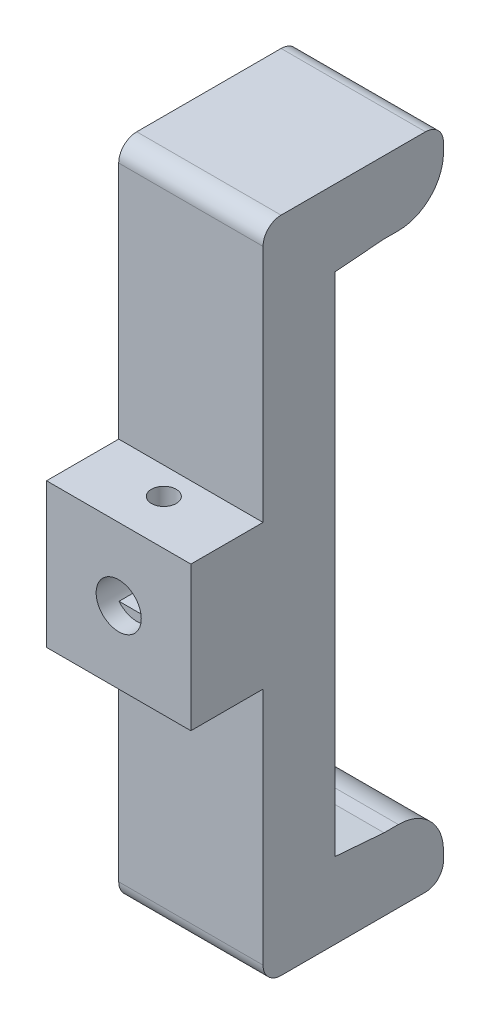
ISO-10303-21;
HEADER;
FILE_DESCRIPTION(('STEP AP214'),'2;1');
FILE_NAME('part.step','',(''),(''),'','','');
FILE_SCHEMA(('AUTOMOTIVE_DESIGN { 1 0 10303 214 1 1 1 1 }'));
ENDSEC;
DATA;
#1=APPLICATION_CONTEXT('core data for automotive mechanical design processes');
#2=APPLICATION_PROTOCOL_DEFINITION('international standard','automotive_design',2000,#1);
#3=PRODUCT_CONTEXT('',#1,'mechanical');
#4=PRODUCT('Part','Part','',(#3));
#5=PRODUCT_RELATED_PRODUCT_CATEGORY('part','',(#4));
#6=PRODUCT_DEFINITION_FORMATION('','',#4);
#7=PRODUCT_DEFINITION_CONTEXT('part definition',#1,'design');
#8=PRODUCT_DEFINITION('design','',#6,#7);
#9=PRODUCT_DEFINITION_SHAPE('','',#8);
#10=(LENGTH_UNIT() NAMED_UNIT(*) SI_UNIT(.MILLI.,.METRE.));
#11=(NAMED_UNIT(*) PLANE_ANGLE_UNIT() SI_UNIT($,.RADIAN.));
#12=(NAMED_UNIT(*) SI_UNIT($,.STERADIAN.) SOLID_ANGLE_UNIT());
#13=UNCERTAINTY_MEASURE_WITH_UNIT(LENGTH_MEASURE(1.E-05),#10,'distance_accuracy_value','');
#14=(GEOMETRIC_REPRESENTATION_CONTEXT(3) GLOBAL_UNCERTAINTY_ASSIGNED_CONTEXT((#13)) GLOBAL_UNIT_ASSIGNED_CONTEXT((#10,
#11,#12)) REPRESENTATION_CONTEXT('',''));
#15=CARTESIAN_POINT('',(0.,0.,0.));
#16=DIRECTION('',(0.,0.,1.));
#17=DIRECTION('',(1.,0.,0.));
#18=AXIS2_PLACEMENT_3D('',#15,#16,#17);
#19=CARTESIAN_POINT('',(0.,-1.55,44.5));
#20=DIRECTION('',(0.,1.,0.));
#21=DIRECTION('',(0.,0.,1.));
#22=AXIS2_PLACEMENT_3D('',#19,#20,#21);
#23=PLANE('',#22);
#24=DIRECTION('',(0.,0.,-1.));
#25=VECTOR('',#24,1.);
#26=CARTESIAN_POINT('',(-1.9615045245933,-1.55,44.5));
#27=LINE('',#26,#25);
#28=CARTESIAN_POINT('',(-1.9615045245933,-1.55,42.5));
#29=VERTEX_POINT('',#28);
#30=CARTESIAN_POINT('',(-1.9615045245933,-1.55,36.5));
#31=VERTEX_POINT('',#30);
#32=EDGE_CURVE('E57',#29,#31,#27,.T.);
#33=ORIENTED_EDGE('',*,*,#32,.F.);
#34=DIRECTION('',(1.,0.,0.));
#35=VECTOR('',#34,1.);
#36=CARTESIAN_POINT('',(0.,-1.55,42.5));
#37=LINE('',#36,#35);
#38=CARTESIAN_POINT('',(1.9615045245933,-1.55,42.5));
#39=VERTEX_POINT('',#38);
#40=EDGE_CURVE('E209',#29,#39,#37,.T.);
#41=ORIENTED_EDGE('',*,*,#40,.T.);
#42=DIRECTION('',(0.,0.,-1.));
#43=VECTOR('',#42,1.);
#44=CARTESIAN_POINT('',(1.9615045245933,-1.55,44.5));
#45=LINE('',#44,#43);
#46=CARTESIAN_POINT('',(1.9615045245933,-1.55,36.5));
#47=VERTEX_POINT('',#46);
#48=EDGE_CURVE('E49',#39,#47,#45,.T.);
#49=ORIENTED_EDGE('',*,*,#48,.T.);
#50=DIRECTION('',(1.,0.,0.));
#51=VECTOR('',#50,1.);
#52=CARTESIAN_POINT('',(0.,-1.55,36.5));
#53=LINE('',#52,#51);
#54=EDGE_CURVE('E428',#31,#47,#53,.T.);
#55=ORIENTED_EDGE('',*,*,#54,.F.);
#56=EDGE_LOOP('',(#33,#41,#49,#55));
#57=FACE_BOUND('',#56,.T.);
#58=ADVANCED_FACE('F34',(#57),#23,.T.);
#59=CARTESIAN_POINT('',(0.,1.55,44.5));
#60=DIRECTION('',(0.,1.,0.));
#61=DIRECTION('',(0.,0.,1.));
#62=AXIS2_PLACEMENT_3D('',#59,#60,#61);
#63=PLANE('',#62);
#64=CARTESIAN_POINT('',(0.,1.55,39.5));
#65=DIRECTION('',(0.,1.,0.));
#66=DIRECTION('',(0.,0.,1.));
#67=AXIS2_PLACEMENT_3D('',#64,#65,#66);
#68=CIRCLE('',#67,1.375);
#69=CARTESIAN_POINT('',(0.,1.55,40.875));
#70=VERTEX_POINT('',#69);
#71=EDGE_CURVE('E441',#70,#70,#68,.F.);
#72=ORIENTED_EDGE('',*,*,#71,.F.);
#73=EDGE_LOOP('',(#72));
#74=FACE_BOUND('',#73,.T.);
#75=DIRECTION('',(1.,0.,0.));
#76=VECTOR('',#75,1.);
#77=CARTESIAN_POINT('',(0.,1.55,42.5));
#78=LINE('',#77,#76);
#79=CARTESIAN_POINT('',(-1.9615045245933,1.55,42.5));
#80=VERTEX_POINT('',#79);
#81=CARTESIAN_POINT('',(1.9615045245933,1.55,42.5));
#82=VERTEX_POINT('',#81);
#83=EDGE_CURVE('E11',#80,#82,#78,.T.);
#84=ORIENTED_EDGE('',*,*,#83,.F.);
#85=DIRECTION('',(0.,0.,-1.));
#86=VECTOR('',#85,1.);
#87=CARTESIAN_POINT('',(-1.9615045245933,1.55,44.5));
#88=LINE('',#87,#86);
#89=CARTESIAN_POINT('',(-1.9615045245933,1.55,36.5));
#90=VERTEX_POINT('',#89);
#91=EDGE_CURVE('E208',#80,#90,#88,.T.);
#92=ORIENTED_EDGE('',*,*,#91,.T.);
#93=DIRECTION('',(1.,0.,0.));
#94=VECTOR('',#93,1.);
#95=CARTESIAN_POINT('',(0.,1.55,36.5));
#96=LINE('',#95,#94);
#97=CARTESIAN_POINT('',(1.9615045245933,1.55,36.5));
#98=VERTEX_POINT('',#97);
#99=EDGE_CURVE('E215',#90,#98,#96,.T.);
#100=ORIENTED_EDGE('',*,*,#99,.T.);
#101=DIRECTION('',(0.,0.,-1.));
#102=VECTOR('',#101,1.);
#103=CARTESIAN_POINT('',(1.9615045245933,1.55,44.5));
#104=LINE('',#103,#102);
#105=EDGE_CURVE('E206',#82,#98,#104,.T.);
#106=ORIENTED_EDGE('',*,*,#105,.F.);
#107=EDGE_LOOP('',(#84,#92,#100,#106));
#108=FACE_BOUND('',#107,.T.);
#109=ADVANCED_FACE('F213',(#74,#108),#63,.F.);
#110=CARTESIAN_POINT('',(8.,0.,36.5));
#111=DIRECTION('',(0.,0.,-1.));
#112=DIRECTION('',(-1.,0.,0.));
#113=AXIS2_PLACEMENT_3D('',#110,#111,#112);
#114=PLANE('',#113);
#115=DIRECTION('',(-1.,0.,0.));
#116=VECTOR('',#115,1.);
#117=CARTESIAN_POINT('',(0.,8.,36.5));
#118=LINE('',#117,#116);
#119=CARTESIAN_POINT('',(8.,8.,36.5));
#120=VERTEX_POINT('',#119);
#121=CARTESIAN_POINT('',(-8.,8.,36.5));
#122=VERTEX_POINT('',#121);
#123=EDGE_CURVE('E415',#120,#122,#118,.T.);
#124=ORIENTED_EDGE('',*,*,#123,.F.);
#125=DIRECTION('',(0.,-1.,0.));
#126=VECTOR('',#125,1.);
#127=CARTESIAN_POINT('',(8.,0.,36.5));
#128=LINE('',#127,#126);
#129=CARTESIAN_POINT('',(8.,34.5,36.5));
#130=VERTEX_POINT('',#129);
#131=EDGE_CURVE('E314',#130,#120,#128,.T.);
#132=ORIENTED_EDGE('',*,*,#131,.F.);
#133=DIRECTION('',(-1.,0.,0.));
#134=VECTOR('',#133,1.);
#135=CARTESIAN_POINT('',(8.,34.5,36.5));
#136=LINE('',#135,#134);
#137=CARTESIAN_POINT('',(-8.,34.5,36.5));
#138=VERTEX_POINT('',#137);
#139=EDGE_CURVE('E317',#130,#138,#136,.T.);
#140=ORIENTED_EDGE('',*,*,#139,.T.);
#141=DIRECTION('',(0.,-1.,0.));
#142=VECTOR('',#141,1.);
#143=CARTESIAN_POINT('',(-8.,0.,36.5));
#144=LINE('',#143,#142);
#145=EDGE_CURVE('E299',#138,#122,#144,.T.);
#146=ORIENTED_EDGE('',*,*,#145,.T.);
#147=EDGE_LOOP('',(#124,#132,#140,#146));
#148=FACE_BOUND('',#147,.T.);
#149=ADVANCED_FACE('F466',(#148),#114,.F.);
#150=CARTESIAN_POINT('',(8.,0.,28.5));
#151=DIRECTION('',(0.,0.,1.));
#152=DIRECTION('',(1.,0.,0.));
#153=AXIS2_PLACEMENT_3D('',#150,#151,#152);
#154=PLANE('',#153);
#155=DIRECTION('',(0.,1.,0.));
#156=VECTOR('',#155,1.);
#157=CARTESIAN_POINT('',(-8.,0.,28.5));
#158=LINE('',#157,#156);
#159=CARTESIAN_POINT('',(-8.,-28.0690186257543,28.5));
#160=VERTEX_POINT('',#159);
#161=CARTESIAN_POINT('',(-8.,28.0690186257543,28.5));
#162=VERTEX_POINT('',#161);
#163=EDGE_CURVE('E295',#160,#162,#158,.T.);
#164=ORIENTED_EDGE('',*,*,#163,.T.);
#165=DIRECTION('',(-1.,0.,0.));
#166=VECTOR('',#165,1.);
#167=CARTESIAN_POINT('',(8.,28.0690186257543,28.5));
#168=LINE('',#167,#166);
#169=CARTESIAN_POINT('',(8.,28.0690186257543,28.5));
#170=VERTEX_POINT('',#169);
#171=EDGE_CURVE('E42',#170,#162,#168,.T.);
#172=ORIENTED_EDGE('',*,*,#171,.F.);
#173=DIRECTION('',(0.,1.,0.));
#174=VECTOR('',#173,1.);
#175=CARTESIAN_POINT('',(8.,0.,28.5));
#176=LINE('',#175,#174);
#177=CARTESIAN_POINT('',(8.,-28.0690186257543,28.5));
#178=VERTEX_POINT('',#177);
#179=EDGE_CURVE('E296',#178,#170,#176,.T.);
#180=ORIENTED_EDGE('',*,*,#179,.F.);
#181=DIRECTION('',(-1.,0.,0.));
#182=VECTOR('',#181,1.);
#183=CARTESIAN_POINT('',(8.,-28.0690186257543,28.5));
#184=LINE('',#183,#182);
#185=EDGE_CURVE('E292',#178,#160,#184,.T.);
#186=ORIENTED_EDGE('',*,*,#185,.T.);
#187=EDGE_LOOP('',(#164,#172,#180,#186));
#188=FACE_BOUND('',#187,.T.);
#189=ADVANCED_FACE('F36',(#188),#154,.F.);
#190=CARTESIAN_POINT('',(8.,28.0690186257543,28.5));
#191=DIRECTION('',(0.,0.99684266207468,0.0794021855358291));
#192=DIRECTION('',(0.,-0.0794021855358291,0.99684266207468));
#193=AXIS2_PLACEMENT_3D('',#190,#191,#192);
#194=PLANE('',#193);
#195=DIRECTION('',(0.,0.0794021855358291,-0.99684266207468));
#196=VECTOR('',#195,1.);
#197=CARTESIAN_POINT('',(-8.,28.0690186257543,28.5));
#198=LINE('',#197,#196);
#199=CARTESIAN_POINT('',(-8.,28.5,23.0893098847535));
#200=VERTEX_POINT('',#199);
#201=EDGE_CURVE('E319',#162,#200,#198,.T.);
#202=ORIENTED_EDGE('',*,*,#201,.T.);
#203=DIRECTION('',(-1.,0.,0.));
#204=VECTOR('',#203,1.);
#205=CARTESIAN_POINT('',(8.,28.5,23.0893098847535));
#206=LINE('',#205,#204);
#207=CARTESIAN_POINT('',(8.,28.5,23.0893098847535));
#208=VERTEX_POINT('',#207);
#209=EDGE_CURVE('E352',#208,#200,#206,.T.);
#210=ORIENTED_EDGE('',*,*,#209,.F.);
#211=DIRECTION('',(0.,0.0794021855358291,-0.99684266207468));
#212=VECTOR('',#211,1.);
#213=CARTESIAN_POINT('',(8.,28.0690186257543,28.5));
#214=LINE('',#213,#212);
#215=EDGE_CURVE('E298',#170,#208,#214,.T.);
#216=ORIENTED_EDGE('',*,*,#215,.F.);
#217=ORIENTED_EDGE('',*,*,#171,.T.);
#218=EDGE_LOOP('',(#202,#210,#216,#217));
#219=FACE_BOUND('',#218,.T.);
#220=ADVANCED_FACE('F359',(#219),#194,.F.);
#221=CARTESIAN_POINT('',(8.,28.5,21.5));
#222=DIRECTION('',(0.,1.,0.));
#223=DIRECTION('',(0.,0.,1.));
#224=AXIS2_PLACEMENT_3D('',#221,#222,#223);
#225=PLANE('',#224);
#226=DIRECTION('',(0.,0.,-1.));
#227=VECTOR('',#226,1.);
#228=CARTESIAN_POINT('',(-8.,28.5,21.5));
#229=LINE('',#228,#227);
#230=CARTESIAN_POINT('',(-8.,28.5,21.5));
#231=VERTEX_POINT('',#230);
#232=EDGE_CURVE('E321',#200,#231,#229,.T.);
#233=ORIENTED_EDGE('',*,*,#232,.T.);
#234=DIRECTION('',(-1.,0.,0.));
#235=VECTOR('',#234,1.);
#236=CARTESIAN_POINT('',(8.,28.5,21.5));
#237=LINE('',#236,#235);
#238=CARTESIAN_POINT('',(8.,28.5,21.5));
#239=VERTEX_POINT('',#238);
#240=EDGE_CURVE('E349',#239,#231,#237,.T.);
#241=ORIENTED_EDGE('',*,*,#240,.F.);
#242=DIRECTION('',(0.,0.,-1.));
#243=VECTOR('',#242,1.);
#244=CARTESIAN_POINT('',(8.,28.5,21.5));
#245=LINE('',#244,#243);
#246=EDGE_CURVE('E301',#208,#239,#245,.T.);
#247=ORIENTED_EDGE('',*,*,#246,.F.);
#248=ORIENTED_EDGE('',*,*,#209,.T.);
#249=EDGE_LOOP('',(#233,#241,#247,#248));
#250=FACE_BOUND('',#249,.T.);
#251=ADVANCED_FACE('F370',(#250),#225,.F.);
#252=CARTESIAN_POINT('',(8.,33.5,21.5));
#253=DIRECTION('',(-1.,0.,0.));
#254=DIRECTION('',(0.,0.,1.));
#255=AXIS2_PLACEMENT_3D('',#252,#253,#254);
#256=CYLINDRICAL_SURFACE('',#255,5.);
#257=CARTESIAN_POINT('',(-8.,33.5,21.5));
#258=DIRECTION('',(1.,0.,0.));
#259=DIRECTION('',(0.,0.,1.));
#260=AXIS2_PLACEMENT_3D('',#257,#258,#259);
#261=CIRCLE('',#260,5.);
#262=CARTESIAN_POINT('',(-8.,33.5,16.5));
#263=VERTEX_POINT('',#262);
#264=EDGE_CURVE('E323',#231,#263,#261,.T.);
#265=ORIENTED_EDGE('',*,*,#264,.T.);
#266=DIRECTION('',(-1.,0.,0.));
#267=VECTOR('',#266,1.);
#268=CARTESIAN_POINT('',(8.,33.5,16.5));
#269=LINE('',#268,#267);
#270=CARTESIAN_POINT('',(8.,33.5,16.5));
#271=VERTEX_POINT('',#270);
#272=EDGE_CURVE('E346',#271,#263,#269,.T.);
#273=ORIENTED_EDGE('',*,*,#272,.F.);
#274=CARTESIAN_POINT('',(8.,33.5,21.5));
#275=DIRECTION('',(1.,0.,0.));
#276=DIRECTION('',(0.,0.,1.));
#277=AXIS2_PLACEMENT_3D('',#274,#275,#276);
#278=CIRCLE('',#277,5.);
#279=EDGE_CURVE('E303',#239,#271,#278,.T.);
#280=ORIENTED_EDGE('',*,*,#279,.F.);
#281=ORIENTED_EDGE('',*,*,#240,.T.);
#282=EDGE_LOOP('',(#265,#273,#280,#281));
#283=FACE_BOUND('',#282,.T.);
#284=ADVANCED_FACE('F374',(#283),#256,.T.);
#285=CARTESIAN_POINT('',(8.,34.5,16.5));
#286=DIRECTION('',(0.,0.,1.));
#287=DIRECTION('',(0.,-1.,0.));
#288=AXIS2_PLACEMENT_3D('',#285,#286,#287);
#289=PLANE('',#288);
#290=DIRECTION('',(0.,1.,0.));
#291=VECTOR('',#290,1.);
#292=CARTESIAN_POINT('',(-8.,34.5,16.5));
#293=LINE('',#292,#291);
#294=CARTESIAN_POINT('',(-8.,34.5,16.5));
#295=VERTEX_POINT('',#294);
#296=EDGE_CURVE('E325',#263,#295,#293,.T.);
#297=ORIENTED_EDGE('',*,*,#296,.T.);
#298=DIRECTION('',(-1.,0.,0.));
#299=VECTOR('',#298,1.);
#300=CARTESIAN_POINT('',(8.,34.5,16.5));
#301=LINE('',#300,#299);
#302=CARTESIAN_POINT('',(8.,34.5,16.5));
#303=VERTEX_POINT('',#302);
#304=EDGE_CURVE('E343',#303,#295,#301,.T.);
#305=ORIENTED_EDGE('',*,*,#304,.F.);
#306=DIRECTION('',(0.,1.,0.));
#307=VECTOR('',#306,1.);
#308=CARTESIAN_POINT('',(8.,34.5,16.5));
#309=LINE('',#308,#307);
#310=EDGE_CURVE('E305',#271,#303,#309,.T.);
#311=ORIENTED_EDGE('',*,*,#310,.F.);
#312=ORIENTED_EDGE('',*,*,#272,.T.);
#313=EDGE_LOOP('',(#297,#305,#311,#312));
#314=FACE_BOUND('',#313,.T.);
#315=ADVANCED_FACE('F480',(#314),#289,.F.);
#316=CARTESIAN_POINT('',(8.,34.5,18.5));
#317=DIRECTION('',(-1.,0.,0.));
#318=DIRECTION('',(0.,0.,1.));
#319=AXIS2_PLACEMENT_3D('',#316,#317,#318);
#320=CYLINDRICAL_SURFACE('',#319,2.);
#321=CARTESIAN_POINT('',(-8.,34.5,18.5));
#322=DIRECTION('',(1.,0.,0.));
#323=DIRECTION('',(0.,0.,1.));
#324=AXIS2_PLACEMENT_3D('',#321,#322,#323);
#325=CIRCLE('',#324,2.);
#326=CARTESIAN_POINT('',(-8.,36.5,18.5));
#327=VERTEX_POINT('',#326);
#328=EDGE_CURVE('E327',#295,#327,#325,.T.);
#329=ORIENTED_EDGE('',*,*,#328,.T.);
#330=DIRECTION('',(-1.,0.,0.));
#331=VECTOR('',#330,1.);
#332=CARTESIAN_POINT('',(8.,36.5,18.5));
#333=LINE('',#332,#331);
#334=CARTESIAN_POINT('',(8.,36.5,18.5));
#335=VERTEX_POINT('',#334);
#336=EDGE_CURVE('E340',#335,#327,#333,.T.);
#337=ORIENTED_EDGE('',*,*,#336,.F.);
#338=CARTESIAN_POINT('',(8.,34.5,18.5));
#339=DIRECTION('',(1.,0.,0.));
#340=DIRECTION('',(0.,0.,1.));
#341=AXIS2_PLACEMENT_3D('',#338,#339,#340);
#342=CIRCLE('',#341,2.);
#343=EDGE_CURVE('E307',#303,#335,#342,.T.);
#344=ORIENTED_EDGE('',*,*,#343,.F.);
#345=ORIENTED_EDGE('',*,*,#304,.T.);
#346=EDGE_LOOP('',(#329,#337,#344,#345));
#347=FACE_BOUND('',#346,.T.);
#348=ADVANCED_FACE('F478',(#347),#320,.T.);
#349=CARTESIAN_POINT('',(8.,36.5,34.5));
#350=DIRECTION('',(0.,-1.,0.));
#351=DIRECTION('',(0.,0.,-1.));
#352=AXIS2_PLACEMENT_3D('',#349,#350,#351);
#353=PLANE('',#352);
#354=DIRECTION('',(0.,0.,1.));
#355=VECTOR('',#354,1.);
#356=CARTESIAN_POINT('',(-8.,36.5,34.5));
#357=LINE('',#356,#355);
#358=CARTESIAN_POINT('',(-8.,36.5,34.5));
#359=VERTEX_POINT('',#358);
#360=EDGE_CURVE('E329',#327,#359,#357,.T.);
#361=ORIENTED_EDGE('',*,*,#360,.T.);
#362=DIRECTION('',(-1.,0.,0.));
#363=VECTOR('',#362,1.);
#364=CARTESIAN_POINT('',(8.,36.5,34.5));
#365=LINE('',#364,#363);
#366=CARTESIAN_POINT('',(8.,36.5,34.5));
#367=VERTEX_POINT('',#366);
#368=EDGE_CURVE('E337',#367,#359,#365,.T.);
#369=ORIENTED_EDGE('',*,*,#368,.F.);
#370=DIRECTION('',(0.,0.,1.));
#371=VECTOR('',#370,1.);
#372=CARTESIAN_POINT('',(8.,36.5,34.5));
#373=LINE('',#372,#371);
#374=EDGE_CURVE('E309',#335,#367,#373,.T.);
#375=ORIENTED_EDGE('',*,*,#374,.F.);
#376=ORIENTED_EDGE('',*,*,#336,.T.);
#377=EDGE_LOOP('',(#361,#369,#375,#376));
#378=FACE_BOUND('',#377,.T.);
#379=ADVANCED_FACE('F473',(#378),#353,.F.);
#380=CARTESIAN_POINT('',(8.,34.5,34.5));
#381=DIRECTION('',(-1.,0.,0.));
#382=DIRECTION('',(0.,0.,1.));
#383=AXIS2_PLACEMENT_3D('',#380,#381,#382);
#384=CYLINDRICAL_SURFACE('',#383,2.);
#385=CARTESIAN_POINT('',(-8.,34.5,34.5));
#386=DIRECTION('',(1.,0.,0.));
#387=DIRECTION('',(0.,0.,1.));
#388=AXIS2_PLACEMENT_3D('',#385,#386,#387);
#389=CIRCLE('',#388,2.);
#390=EDGE_CURVE('E331',#359,#138,#389,.T.);
#391=ORIENTED_EDGE('',*,*,#390,.T.);
#392=ORIENTED_EDGE('',*,*,#139,.F.);
#393=CARTESIAN_POINT('',(8.,34.5,34.5));
#394=DIRECTION('',(1.,0.,0.));
#395=DIRECTION('',(0.,0.,1.));
#396=AXIS2_PLACEMENT_3D('',#393,#394,#395);
#397=CIRCLE('',#396,2.);
#398=EDGE_CURVE('E311',#367,#130,#397,.T.);
#399=ORIENTED_EDGE('',*,*,#398,.F.);
#400=ORIENTED_EDGE('',*,*,#368,.T.);
#401=EDGE_LOOP('',(#391,#392,#399,#400));
#402=FACE_BOUND('',#401,.T.);
#403=ADVANCED_FACE('F468',(#402),#384,.T.);
#404=CARTESIAN_POINT('',(8.,-7.99999999999999,36.5));
#405=VERTEX_POINT('',#404);
#406=CARTESIAN_POINT('',(8.,-34.5,36.5));
#407=VERTEX_POINT('',#406);
#408=EDGE_CURVE('E313',#405,#407,#128,.T.);
#409=ORIENTED_EDGE('',*,*,#408,.F.);
#410=DIRECTION('',(-1.,0.,0.));
#411=VECTOR('',#410,1.);
#412=CARTESIAN_POINT('',(0.,-8.,36.5));
#413=LINE('',#412,#411);
#414=CARTESIAN_POINT('',(-8.,-8.,36.5));
#415=VERTEX_POINT('',#414);
#416=EDGE_CURVE('E410',#405,#415,#413,.T.);
#417=ORIENTED_EDGE('',*,*,#416,.T.);
#418=CARTESIAN_POINT('',(-8.,-34.5,36.5));
#419=VERTEX_POINT('',#418);
#420=EDGE_CURVE('E333',#415,#419,#144,.T.);
#421=ORIENTED_EDGE('',*,*,#420,.T.);
#422=DIRECTION('',(-1.,0.,0.));
#423=VECTOR('',#422,1.);
#424=CARTESIAN_POINT('',(8.,-34.5,36.5));
#425=LINE('',#424,#423);
#426=EDGE_CURVE('E251',#407,#419,#425,.T.);
#427=ORIENTED_EDGE('',*,*,#426,.F.);
#428=EDGE_LOOP('',(#409,#417,#421,#427));
#429=FACE_BOUND('',#428,.T.);
#430=ADVANCED_FACE('F411',(#429),#114,.F.);
#431=CARTESIAN_POINT('',(8.,33.5,21.5));
#432=DIRECTION('',(-1.,0.,0.));
#433=DIRECTION('',(0.,0.,1.));
#434=AXIS2_PLACEMENT_3D('',#431,#432,#433);
#435=PLANE('',#434);
#436=ORIENTED_EDGE('',*,*,#131,.T.);
#437=DIRECTION('',(0.,0.,-1.));
#438=VECTOR('',#437,1.);
#439=CARTESIAN_POINT('',(8.,8.,44.5));
#440=LINE('',#439,#438);
#441=CARTESIAN_POINT('',(8.,8.,44.5));
#442=VERTEX_POINT('',#441);
#443=EDGE_CURVE('E223',#442,#120,#440,.T.);
#444=ORIENTED_EDGE('',*,*,#443,.F.);
#445=DIRECTION('',(0.,1.,0.));
#446=VECTOR('',#445,1.);
#447=CARTESIAN_POINT('',(8.,0.,44.5));
#448=LINE('',#447,#446);
#449=CARTESIAN_POINT('',(8.,-8.,44.5));
#450=VERTEX_POINT('',#449);
#451=EDGE_CURVE('E435',#450,#442,#448,.T.);
#452=ORIENTED_EDGE('',*,*,#451,.F.);
#453=DIRECTION('',(0.,0.,-1.));
#454=VECTOR('',#453,1.);
#455=CARTESIAN_POINT('',(8.,-8.,44.5));
#456=LINE('',#455,#454);
#457=EDGE_CURVE('E228',#450,#405,#456,.T.);
#458=ORIENTED_EDGE('',*,*,#457,.T.);
#459=ORIENTED_EDGE('',*,*,#408,.T.);
#460=CARTESIAN_POINT('',(8.,-34.5,34.5));
#461=DIRECTION('',(-1.,0.,0.));
#462=DIRECTION('',(0.,0.,1.));
#463=AXIS2_PLACEMENT_3D('',#460,#461,#462);
#464=CIRCLE('',#463,2.);
#465=CARTESIAN_POINT('',(8.,-36.5,34.5));
#466=VERTEX_POINT('',#465);
#467=EDGE_CURVE('E248',#466,#407,#464,.T.);
#468=ORIENTED_EDGE('',*,*,#467,.F.);
#469=DIRECTION('',(0.,0.,1.));
#470=VECTOR('',#469,1.);
#471=CARTESIAN_POINT('',(8.,-36.5,34.5));
#472=LINE('',#471,#470);
#473=CARTESIAN_POINT('',(8.,-36.5,18.5));
#474=VERTEX_POINT('',#473);
#475=EDGE_CURVE('E245',#474,#466,#472,.T.);
#476=ORIENTED_EDGE('',*,*,#475,.F.);
#477=CARTESIAN_POINT('',(8.,-34.5,18.5));
#478=DIRECTION('',(-1.,0.,0.));
#479=DIRECTION('',(0.,0.,1.));
#480=AXIS2_PLACEMENT_3D('',#477,#478,#479);
#481=CIRCLE('',#480,2.);
#482=CARTESIAN_POINT('',(8.,-34.5,16.5));
#483=VERTEX_POINT('',#482);
#484=EDGE_CURVE('E242',#483,#474,#481,.T.);
#485=ORIENTED_EDGE('',*,*,#484,.F.);
#486=DIRECTION('',(0.,-1.,0.));
#487=VECTOR('',#486,1.);
#488=CARTESIAN_POINT('',(8.,-34.5,16.5));
#489=LINE('',#488,#487);
#490=CARTESIAN_POINT('',(8.,-33.5,16.5));
#491=VERTEX_POINT('',#490);
#492=EDGE_CURVE('E239',#491,#483,#489,.T.);
#493=ORIENTED_EDGE('',*,*,#492,.F.);
#494=CARTESIAN_POINT('',(8.,-33.5,21.5));
#495=DIRECTION('',(-1.,0.,0.));
#496=DIRECTION('',(0.,0.,1.));
#497=AXIS2_PLACEMENT_3D('',#494,#495,#496);
#498=CIRCLE('',#497,5.);
#499=CARTESIAN_POINT('',(8.,-28.5,21.5));
#500=VERTEX_POINT('',#499);
#501=EDGE_CURVE('E236',#500,#491,#498,.T.);
#502=ORIENTED_EDGE('',*,*,#501,.F.);
#503=DIRECTION('',(0.,0.,-1.));
#504=VECTOR('',#503,1.);
#505=CARTESIAN_POINT('',(8.,-28.5,21.5));
#506=LINE('',#505,#504);
#507=CARTESIAN_POINT('',(8.,-28.5,23.0893098847535));
#508=VERTEX_POINT('',#507);
#509=EDGE_CURVE('E232',#508,#500,#506,.T.);
#510=ORIENTED_EDGE('',*,*,#509,.F.);
#511=DIRECTION('',(0.,-0.0794021855358291,-0.99684266207468));
#512=VECTOR('',#511,1.);
#513=CARTESIAN_POINT('',(8.,-28.0690186257543,28.5));
#514=LINE('',#513,#512);
#515=EDGE_CURVE('E229',#178,#508,#514,.T.);
#516=ORIENTED_EDGE('',*,*,#515,.F.);
#517=ORIENTED_EDGE('',*,*,#179,.T.);
#518=ORIENTED_EDGE('',*,*,#215,.T.);
#519=ORIENTED_EDGE('',*,*,#246,.T.);
#520=ORIENTED_EDGE('',*,*,#279,.T.);
#521=ORIENTED_EDGE('',*,*,#310,.T.);
#522=ORIENTED_EDGE('',*,*,#343,.T.);
#523=ORIENTED_EDGE('',*,*,#374,.T.);
#524=ORIENTED_EDGE('',*,*,#398,.T.);
#525=EDGE_LOOP('',(#436,#444,#452,#458,#459,#468,#476,#485,#493,#502,#510,#516,#517,#518,#519,
#520,#521,#522,#523,#524));
#526=FACE_BOUND('',#525,.T.);
#527=ADVANCED_FACE('F378',(#526),#435,.F.);
#528=CARTESIAN_POINT('',(-8.,33.5,21.5));
#529=DIRECTION('',(-1.,0.,0.));
#530=DIRECTION('',(0.,0.,1.));
#531=AXIS2_PLACEMENT_3D('',#528,#529,#530);
#532=PLANE('',#531);
#533=ORIENTED_EDGE('',*,*,#163,.F.);
#534=DIRECTION('',(0.,-0.0794021855358291,-0.99684266207468));
#535=VECTOR('',#534,1.);
#536=CARTESIAN_POINT('',(-8.,-28.0690186257543,28.5));
#537=LINE('',#536,#535);
#538=CARTESIAN_POINT('',(-8.,-28.5,23.0893098847535));
#539=VERTEX_POINT('',#538);
#540=EDGE_CURVE('E252',#160,#539,#537,.T.);
#541=ORIENTED_EDGE('',*,*,#540,.T.);
#542=DIRECTION('',(0.,0.,-1.));
#543=VECTOR('',#542,1.);
#544=CARTESIAN_POINT('',(-8.,-28.5,21.5));
#545=LINE('',#544,#543);
#546=CARTESIAN_POINT('',(-8.,-28.5,21.5));
#547=VERTEX_POINT('',#546);
#548=EDGE_CURVE('E255',#539,#547,#545,.T.);
#549=ORIENTED_EDGE('',*,*,#548,.T.);
#550=CARTESIAN_POINT('',(-8.,-33.5,21.5));
#551=DIRECTION('',(-1.,0.,0.));
#552=DIRECTION('',(0.,0.,1.));
#553=AXIS2_PLACEMENT_3D('',#550,#551,#552);
#554=CIRCLE('',#553,5.);
#555=CARTESIAN_POINT('',(-8.,-33.5,16.5));
#556=VERTEX_POINT('',#555);
#557=EDGE_CURVE('E258',#547,#556,#554,.T.);
#558=ORIENTED_EDGE('',*,*,#557,.T.);
#559=DIRECTION('',(0.,-1.,0.));
#560=VECTOR('',#559,1.);
#561=CARTESIAN_POINT('',(-8.,-34.5,16.5));
#562=LINE('',#561,#560);
#563=CARTESIAN_POINT('',(-8.,-34.5,16.5));
#564=VERTEX_POINT('',#563);
#565=EDGE_CURVE('E261',#556,#564,#562,.T.);
#566=ORIENTED_EDGE('',*,*,#565,.T.);
#567=CARTESIAN_POINT('',(-8.,-34.5,18.5));
#568=DIRECTION('',(-1.,0.,0.));
#569=DIRECTION('',(0.,0.,1.));
#570=AXIS2_PLACEMENT_3D('',#567,#568,#569);
#571=CIRCLE('',#570,2.);
#572=CARTESIAN_POINT('',(-8.,-36.5,18.5));
#573=VERTEX_POINT('',#572);
#574=EDGE_CURVE('E264',#564,#573,#571,.T.);
#575=ORIENTED_EDGE('',*,*,#574,.T.);
#576=DIRECTION('',(0.,0.,1.));
#577=VECTOR('',#576,1.);
#578=CARTESIAN_POINT('',(-8.,-36.5,34.5));
#579=LINE('',#578,#577);
#580=CARTESIAN_POINT('',(-8.,-36.5,34.5));
#581=VERTEX_POINT('',#580);
#582=EDGE_CURVE('E267',#573,#581,#579,.T.);
#583=ORIENTED_EDGE('',*,*,#582,.T.);
#584=CARTESIAN_POINT('',(-8.,-34.5,34.5));
#585=DIRECTION('',(-1.,0.,0.));
#586=DIRECTION('',(0.,0.,1.));
#587=AXIS2_PLACEMENT_3D('',#584,#585,#586);
#588=CIRCLE('',#587,2.);
#589=EDGE_CURVE('E233',#581,#419,#588,.T.);
#590=ORIENTED_EDGE('',*,*,#589,.T.);
#591=ORIENTED_EDGE('',*,*,#420,.F.);
#592=DIRECTION('',(0.,0.,-1.));
#593=VECTOR('',#592,1.);
#594=CARTESIAN_POINT('',(-8.,-8.,44.5));
#595=LINE('',#594,#593);
#596=CARTESIAN_POINT('',(-8.,-8.,44.5));
#597=VERTEX_POINT('',#596);
#598=EDGE_CURVE('E407',#597,#415,#595,.T.);
#599=ORIENTED_EDGE('',*,*,#598,.F.);
#600=DIRECTION('',(0.,-1.,0.));
#601=VECTOR('',#600,1.);
#602=CARTESIAN_POINT('',(-8.,0.,44.5));
#603=LINE('',#602,#601);
#604=CARTESIAN_POINT('',(-8.,8.,44.5));
#605=VERTEX_POINT('',#604);
#606=EDGE_CURVE('E220',#605,#597,#603,.T.);
#607=ORIENTED_EDGE('',*,*,#606,.F.);
#608=DIRECTION('',(0.,0.,-1.));
#609=VECTOR('',#608,1.);
#610=CARTESIAN_POINT('',(-8.,8.,44.5));
#611=LINE('',#610,#609);
#612=EDGE_CURVE('E419',#605,#122,#611,.T.);
#613=ORIENTED_EDGE('',*,*,#612,.T.);
#614=ORIENTED_EDGE('',*,*,#145,.F.);
#615=ORIENTED_EDGE('',*,*,#390,.F.);
#616=ORIENTED_EDGE('',*,*,#360,.F.);
#617=ORIENTED_EDGE('',*,*,#328,.F.);
#618=ORIENTED_EDGE('',*,*,#296,.F.);
#619=ORIENTED_EDGE('',*,*,#264,.F.);
#620=ORIENTED_EDGE('',*,*,#232,.F.);
#621=ORIENTED_EDGE('',*,*,#201,.F.);
#622=EDGE_LOOP('',(#533,#541,#549,#558,#566,#575,#583,#590,#591,#599,#607,#613,#614,#615,#616,
#617,#618,#619,#620,#621));
#623=FACE_BOUND('',#622,.T.);
#624=ADVANCED_FACE('F364',(#623),#532,.T.);
#625=CARTESIAN_POINT('',(8.,-28.0690186257543,28.5));
#626=DIRECTION('',(0.,-0.99684266207468,0.0794021855358291));
#627=DIRECTION('',(0.,0.0794021855358291,0.99684266207468));
#628=AXIS2_PLACEMENT_3D('',#625,#626,#627);
#629=PLANE('',#628);
#630=ORIENTED_EDGE('',*,*,#540,.F.);
#631=ORIENTED_EDGE('',*,*,#185,.F.);
#632=ORIENTED_EDGE('',*,*,#515,.T.);
#633=DIRECTION('',(-1.,0.,0.));
#634=VECTOR('',#633,1.);
#635=CARTESIAN_POINT('',(8.,-28.5,23.0893098847535));
#636=LINE('',#635,#634);
#637=EDGE_CURVE('E289',#508,#539,#636,.T.);
#638=ORIENTED_EDGE('',*,*,#637,.T.);
#639=EDGE_LOOP('',(#630,#631,#632,#638));
#640=FACE_BOUND('',#639,.T.);
#641=ADVANCED_FACE('F383',(#640),#629,.F.);
#642=CARTESIAN_POINT('',(8.,-28.5,21.5));
#643=DIRECTION('',(0.,-1.,0.));
#644=DIRECTION('',(0.,0.,1.));
#645=AXIS2_PLACEMENT_3D('',#642,#643,#644);
#646=PLANE('',#645);
#647=ORIENTED_EDGE('',*,*,#548,.F.);
#648=ORIENTED_EDGE('',*,*,#637,.F.);
#649=ORIENTED_EDGE('',*,*,#509,.T.);
#650=DIRECTION('',(-1.,0.,0.));
#651=VECTOR('',#650,1.);
#652=CARTESIAN_POINT('',(8.,-28.5,21.5));
#653=LINE('',#652,#651);
#654=EDGE_CURVE('E286',#500,#547,#653,.T.);
#655=ORIENTED_EDGE('',*,*,#654,.T.);
#656=EDGE_LOOP('',(#647,#648,#649,#655));
#657=FACE_BOUND('',#656,.T.);
#658=ADVANCED_FACE('F386',(#657),#646,.F.);
#659=CARTESIAN_POINT('',(8.,-33.5,21.5));
#660=DIRECTION('',(-1.,0.,0.));
#661=DIRECTION('',(0.,0.,1.));
#662=AXIS2_PLACEMENT_3D('',#659,#660,#661);
#663=CYLINDRICAL_SURFACE('',#662,5.);
#664=ORIENTED_EDGE('',*,*,#557,.F.);
#665=ORIENTED_EDGE('',*,*,#654,.F.);
#666=ORIENTED_EDGE('',*,*,#501,.T.);
#667=DIRECTION('',(-1.,0.,0.));
#668=VECTOR('',#667,1.);
#669=CARTESIAN_POINT('',(8.,-33.5,16.5));
#670=LINE('',#669,#668);
#671=EDGE_CURVE('E283',#491,#556,#670,.T.);
#672=ORIENTED_EDGE('',*,*,#671,.T.);
#673=EDGE_LOOP('',(#664,#665,#666,#672));
#674=FACE_BOUND('',#673,.T.);
#675=ADVANCED_FACE('F389',(#674),#663,.T.);
#676=CARTESIAN_POINT('',(8.,-34.5,16.5));
#677=DIRECTION('',(0.,0.,1.));
#678=DIRECTION('',(0.,1.,0.));
#679=AXIS2_PLACEMENT_3D('',#676,#677,#678);
#680=PLANE('',#679);
#681=ORIENTED_EDGE('',*,*,#565,.F.);
#682=ORIENTED_EDGE('',*,*,#671,.F.);
#683=ORIENTED_EDGE('',*,*,#492,.T.);
#684=DIRECTION('',(-1.,0.,0.));
#685=VECTOR('',#684,1.);
#686=CARTESIAN_POINT('',(8.,-34.5,16.5));
#687=LINE('',#686,#685);
#688=EDGE_CURVE('E280',#483,#564,#687,.T.);
#689=ORIENTED_EDGE('',*,*,#688,.T.);
#690=EDGE_LOOP('',(#681,#682,#683,#689));
#691=FACE_BOUND('',#690,.T.);
#692=ADVANCED_FACE('F392',(#691),#680,.F.);
#693=CARTESIAN_POINT('',(8.,-34.5,18.5));
#694=DIRECTION('',(-1.,0.,0.));
#695=DIRECTION('',(0.,0.,1.));
#696=AXIS2_PLACEMENT_3D('',#693,#694,#695);
#697=CYLINDRICAL_SURFACE('',#696,2.);
#698=ORIENTED_EDGE('',*,*,#574,.F.);
#699=ORIENTED_EDGE('',*,*,#688,.F.);
#700=ORIENTED_EDGE('',*,*,#484,.T.);
#701=DIRECTION('',(-1.,0.,0.));
#702=VECTOR('',#701,1.);
#703=CARTESIAN_POINT('',(8.,-36.5,18.5));
#704=LINE('',#703,#702);
#705=EDGE_CURVE('E277',#474,#573,#704,.T.);
#706=ORIENTED_EDGE('',*,*,#705,.T.);
#707=EDGE_LOOP('',(#698,#699,#700,#706));
#708=FACE_BOUND('',#707,.T.);
#709=ADVANCED_FACE('F395',(#708),#697,.T.);
#710=CARTESIAN_POINT('',(8.,-36.5,34.5));
#711=DIRECTION('',(0.,1.,0.));
#712=DIRECTION('',(0.,0.,-1.));
#713=AXIS2_PLACEMENT_3D('',#710,#711,#712);
#714=PLANE('',#713);
#715=ORIENTED_EDGE('',*,*,#582,.F.);
#716=ORIENTED_EDGE('',*,*,#705,.F.);
#717=ORIENTED_EDGE('',*,*,#475,.T.);
#718=DIRECTION('',(-1.,0.,0.));
#719=VECTOR('',#718,1.);
#720=CARTESIAN_POINT('',(8.,-36.5,34.5));
#721=LINE('',#720,#719);
#722=EDGE_CURVE('E274',#466,#581,#721,.T.);
#723=ORIENTED_EDGE('',*,*,#722,.T.);
#724=EDGE_LOOP('',(#715,#716,#717,#723));
#725=FACE_BOUND('',#724,.T.);
#726=ADVANCED_FACE('F398',(#725),#714,.F.);
#727=CARTESIAN_POINT('',(8.,-34.5,34.5));
#728=DIRECTION('',(-1.,0.,0.));
#729=DIRECTION('',(0.,0.,1.));
#730=AXIS2_PLACEMENT_3D('',#727,#728,#729);
#731=CYLINDRICAL_SURFACE('',#730,2.);
#732=ORIENTED_EDGE('',*,*,#589,.F.);
#733=ORIENTED_EDGE('',*,*,#722,.F.);
#734=ORIENTED_EDGE('',*,*,#467,.T.);
#735=ORIENTED_EDGE('',*,*,#426,.T.);
#736=EDGE_LOOP('',(#732,#733,#734,#735));
#737=FACE_BOUND('',#736,.T.);
#738=ADVANCED_FACE('F401',(#737),#731,.T.);
#739=CARTESIAN_POINT('',(0.,8.,44.5));
#740=DIRECTION('',(0.,-1.,0.));
#741=DIRECTION('',(0.,0.,-1.));
#742=AXIS2_PLACEMENT_3D('',#739,#740,#741);
#743=PLANE('',#742);
#744=CARTESIAN_POINT('',(0.,8.,39.5));
#745=DIRECTION('',(0.,1.,0.));
#746=DIRECTION('',(0.,0.,1.));
#747=AXIS2_PLACEMENT_3D('',#744,#745,#746);
#748=CIRCLE('',#747,1.375);
#749=CARTESIAN_POINT('',(0.,8.,40.875));
#750=VERTEX_POINT('',#749);
#751=EDGE_CURVE('E444',#750,#750,#748,.T.);
#752=ORIENTED_EDGE('',*,*,#751,.F.);
#753=EDGE_LOOP('',(#752));
#754=FACE_BOUND('',#753,.T.);
#755=ORIENTED_EDGE('',*,*,#123,.T.);
#756=ORIENTED_EDGE('',*,*,#612,.F.);
#757=DIRECTION('',(-1.,0.,0.));
#758=VECTOR('',#757,1.);
#759=CARTESIAN_POINT('',(0.,8.,44.5));
#760=LINE('',#759,#758);
#761=EDGE_CURVE('E433',#442,#605,#760,.T.);
#762=ORIENTED_EDGE('',*,*,#761,.F.);
#763=ORIENTED_EDGE('',*,*,#443,.T.);
#764=EDGE_LOOP('',(#755,#756,#762,#763));
#765=FACE_BOUND('',#764,.T.);
#766=ADVANCED_FACE('F450',(#754,#765),#743,.F.);
#767=CARTESIAN_POINT('',(0.,0.,44.5));
#768=DIRECTION('',(0.,0.,-1.));
#769=DIRECTION('',(-1.,0.,0.));
#770=AXIS2_PLACEMENT_3D('',#767,#768,#769);
#771=CYLINDRICAL_SURFACE('',#770,2.5);
#772=CARTESIAN_POINT('',(0.,0.,42.5));
#773=DIRECTION('',(0.,0.,1.));
#774=DIRECTION('',(1.,0.,0.));
#775=AXIS2_PLACEMENT_3D('',#772,#773,#774);
#776=CIRCLE('',#775,2.5);
#777=EDGE_CURVE('E210',#29,#39,#776,.T.);
#778=ORIENTED_EDGE('',*,*,#777,.F.);
#779=ORIENTED_EDGE('',*,*,#32,.T.);
#780=CARTESIAN_POINT('',(0.,0.,36.5));
#781=DIRECTION('',(0.,0.,1.));
#782=DIRECTION('',(1.,0.,0.));
#783=AXIS2_PLACEMENT_3D('',#780,#781,#782);
#784=CIRCLE('',#783,2.5);
#785=EDGE_CURVE('E427',#90,#31,#784,.T.);
#786=ORIENTED_EDGE('',*,*,#785,.F.);
#787=ORIENTED_EDGE('',*,*,#91,.F.);
#788=EDGE_CURVE('E199',#82,#80,#776,.T.);
#789=ORIENTED_EDGE('',*,*,#788,.F.);
#790=ORIENTED_EDGE('',*,*,#105,.T.);
#791=EDGE_CURVE('E430',#47,#98,#784,.T.);
#792=ORIENTED_EDGE('',*,*,#791,.F.);
#793=ORIENTED_EDGE('',*,*,#48,.F.);
#794=EDGE_LOOP('',(#778,#779,#786,#787,#789,#790,#792,#793));
#795=FACE_BOUND('',#794,.T.);
#796=CARTESIAN_POINT('',(0.,0.,44.5));
#797=DIRECTION('',(0.,0.,1.));
#798=DIRECTION('',(1.,0.,0.));
#799=AXIS2_PLACEMENT_3D('',#796,#797,#798);
#800=CIRCLE('',#799,2.5);
#801=CARTESIAN_POINT('',(2.5,0.,44.5));
#802=VERTEX_POINT('',#801);
#803=EDGE_CURVE('E414',#802,#802,#800,.T.);
#804=ORIENTED_EDGE('',*,*,#803,.T.);
#805=EDGE_LOOP('',(#804));
#806=FACE_BOUND('',#805,.T.);
#807=ADVANCED_FACE('F203',(#795,#806),#771,.F.);
#808=CARTESIAN_POINT('',(0.,-8.,44.5));
#809=DIRECTION('',(0.,-1.,0.));
#810=DIRECTION('',(0.,0.,-1.));
#811=AXIS2_PLACEMENT_3D('',#808,#809,#810);
#812=PLANE('',#811);
#813=ORIENTED_EDGE('',*,*,#416,.F.);
#814=ORIENTED_EDGE('',*,*,#457,.F.);
#815=DIRECTION('',(-1.,0.,0.));
#816=VECTOR('',#815,1.);
#817=CARTESIAN_POINT('',(0.,-8.,44.5));
#818=LINE('',#817,#816);
#819=EDGE_CURVE('E216',#450,#597,#818,.T.);
#820=ORIENTED_EDGE('',*,*,#819,.T.);
#821=ORIENTED_EDGE('',*,*,#598,.T.);
#822=EDGE_LOOP('',(#813,#814,#820,#821));
#823=FACE_BOUND('',#822,.T.);
#824=ADVANCED_FACE('F417',(#823),#812,.T.);
#825=CARTESIAN_POINT('',(0.,0.,44.5));
#826=DIRECTION('',(0.,0.,1.));
#827=DIRECTION('',(1.,0.,0.));
#828=AXIS2_PLACEMENT_3D('',#825,#826,#827);
#829=PLANE('',#828);
#830=ORIENTED_EDGE('',*,*,#803,.F.);
#831=EDGE_LOOP('',(#830));
#832=FACE_BOUND('',#831,.T.);
#833=ORIENTED_EDGE('',*,*,#451,.T.);
#834=ORIENTED_EDGE('',*,*,#761,.T.);
#835=ORIENTED_EDGE('',*,*,#606,.T.);
#836=ORIENTED_EDGE('',*,*,#819,.F.);
#837=EDGE_LOOP('',(#833,#834,#835,#836));
#838=FACE_BOUND('',#837,.T.);
#839=ADVANCED_FACE('F462',(#832,#838),#829,.T.);
#840=ORIENTED_EDGE('',*,*,#54,.T.);
#841=ORIENTED_EDGE('',*,*,#791,.T.);
#842=ORIENTED_EDGE('',*,*,#99,.F.);
#843=ORIENTED_EDGE('',*,*,#785,.T.);
#844=EDGE_LOOP('',(#840,#841,#842,#843));
#845=FACE_BOUND('',#844,.T.);
#846=ADVANCED_FACE('F518',(#845),#114,.F.);
#847=CARTESIAN_POINT('',(0.,0.,42.5));
#848=DIRECTION('',(0.,0.,1.));
#849=DIRECTION('',(1.,0.,0.));
#850=AXIS2_PLACEMENT_3D('',#847,#848,#849);
#851=PLANE('',#850);
#852=ORIENTED_EDGE('',*,*,#777,.T.);
#853=ORIENTED_EDGE('',*,*,#40,.F.);
#854=EDGE_LOOP('',(#852,#853));
#855=FACE_BOUND('',#854,.T.);
#856=ADVANCED_FACE('F619',(#855),#851,.T.);
#857=ORIENTED_EDGE('',*,*,#83,.T.);
#858=ORIENTED_EDGE('',*,*,#788,.T.);
#859=EDGE_LOOP('',(#857,#858));
#860=FACE_BOUND('',#859,.T.);
#861=ADVANCED_FACE('F198',(#860),#851,.T.);
#862=CARTESIAN_POINT('',(0.,-2.33908729652601,39.5));
#863=DIRECTION('',(0.,1.,0.));
#864=DIRECTION('',(0.,0.,1.));
#865=AXIS2_PLACEMENT_3D('',#862,#863,#864);
#866=CYLINDRICAL_SURFACE('',#865,1.375);
#867=ORIENTED_EDGE('',*,*,#71,.T.);
#868=EDGE_LOOP('',(#867));
#869=FACE_BOUND('',#868,.T.);
#870=ORIENTED_EDGE('',*,*,#751,.T.);
#871=EDGE_LOOP('',(#870));
#872=FACE_BOUND('',#871,.T.);
#873=ADVANCED_FACE('F448',(#869,#872),#866,.F.);
#874=CLOSED_SHELL('',(#58,#109,#149,#189,#220,#251,#284,#315,#348,#379,#403,#430,#527,#624,#641,
#658,#675,#692,#709,#726,#738,#766,#807,#824,#839,#846,#856,#861,#873));
#875=MANIFOLD_SOLID_BREP('B2',#874);
#876=ADVANCED_BREP_SHAPE_REPRESENTATION('',(#18,#875),#14);
#877=SHAPE_DEFINITION_REPRESENTATION(#9,#876);
ENDSEC;
END-ISO-10303-21;
